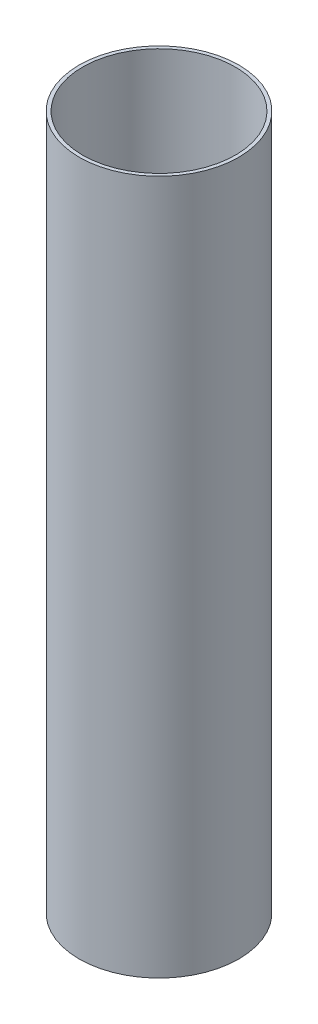
ISO-10303-21;
HEADER;
FILE_DESCRIPTION(('STEP AP214'),'2;1');
FILE_NAME('part.step','',(''),(''),'','','');
FILE_SCHEMA(('AUTOMOTIVE_DESIGN { 1 0 10303 214 1 1 1 1 }'));
ENDSEC;
DATA;
#1=APPLICATION_CONTEXT('core data for automotive mechanical design processes');
#2=APPLICATION_PROTOCOL_DEFINITION('international standard','automotive_design',2000,#1);
#3=PRODUCT_CONTEXT('',#1,'mechanical');
#4=PRODUCT('Part','Part','',(#3));
#5=PRODUCT_RELATED_PRODUCT_CATEGORY('part','',(#4));
#6=PRODUCT_DEFINITION_FORMATION('','',#4);
#7=PRODUCT_DEFINITION_CONTEXT('part definition',#1,'design');
#8=PRODUCT_DEFINITION('design','',#6,#7);
#9=PRODUCT_DEFINITION_SHAPE('','',#8);
#10=(LENGTH_UNIT() NAMED_UNIT(*) SI_UNIT(.MILLI.,.METRE.));
#11=(NAMED_UNIT(*) PLANE_ANGLE_UNIT() SI_UNIT($,.RADIAN.));
#12=(NAMED_UNIT(*) SI_UNIT($,.STERADIAN.) SOLID_ANGLE_UNIT());
#13=UNCERTAINTY_MEASURE_WITH_UNIT(LENGTH_MEASURE(1.E-05),#10,'distance_accuracy_value','');
#14=(GEOMETRIC_REPRESENTATION_CONTEXT(3) GLOBAL_UNCERTAINTY_ASSIGNED_CONTEXT((#13)) GLOBAL_UNIT_ASSIGNED_CONTEXT((#10,
#11,#12)) REPRESENTATION_CONTEXT('',''));
#15=CARTESIAN_POINT('',(0.,0.,0.));
#16=DIRECTION('',(0.,0.,1.));
#17=DIRECTION('',(1.,0.,0.));
#18=AXIS2_PLACEMENT_3D('',#15,#16,#17);
#19=CARTESIAN_POINT('',(0.,1000.,0.));
#20=DIRECTION('',(0.,1.,0.));
#21=DIRECTION('',(0.,0.,1.));
#22=AXIS2_PLACEMENT_3D('',#19,#20,#21);
#23=PLANE('',#22);
#24=CARTESIAN_POINT('',(0.,1000.,0.));
#25=DIRECTION('',(0.,1.,0.));
#26=DIRECTION('',(1.,0.,0.));
#27=AXIS2_PLACEMENT_3D('',#24,#25,#26);
#28=CIRCLE('',#27,115.);
#29=CARTESIAN_POINT('',(115.,1000.,0.));
#30=VERTEX_POINT('',#29);
#31=EDGE_CURVE('E11',#30,#30,#28,.T.);
#32=ORIENTED_EDGE('',*,*,#31,.T.);
#33=EDGE_LOOP('',(#32));
#34=FACE_BOUND('',#33,.T.);
#35=CARTESIAN_POINT('',(0.,1000.,0.));
#36=DIRECTION('',(0.,1.,0.));
#37=DIRECTION('',(0.,0.,1.));
#38=AXIS2_PLACEMENT_3D('',#35,#36,#37);
#39=CIRCLE('',#38,110.);
#40=CARTESIAN_POINT('',(0.,1000.,110.));
#41=VERTEX_POINT('',#40);
#42=EDGE_CURVE('E52',#41,#41,#39,.T.);
#43=ORIENTED_EDGE('',*,*,#42,.F.);
#44=EDGE_LOOP('',(#43));
#45=FACE_BOUND('',#44,.T.);
#46=ADVANCED_FACE('F41',(#34,#45),#23,.T.);
#47=CARTESIAN_POINT('',(0.,0.,0.));
#48=DIRECTION('',(0.,1.,0.));
#49=DIRECTION('',(0.,0.,1.));
#50=AXIS2_PLACEMENT_3D('',#47,#48,#49);
#51=PLANE('',#50);
#52=CARTESIAN_POINT('',(0.,0.,0.));
#53=DIRECTION('',(0.,1.,0.));
#54=DIRECTION('',(1.,0.,0.));
#55=AXIS2_PLACEMENT_3D('',#52,#53,#54);
#56=CIRCLE('',#55,115.);
#57=CARTESIAN_POINT('',(115.,0.,0.));
#58=VERTEX_POINT('',#57);
#59=EDGE_CURVE('E45',#58,#58,#56,.T.);
#60=ORIENTED_EDGE('',*,*,#59,.F.);
#61=EDGE_LOOP('',(#60));
#62=FACE_BOUND('',#61,.T.);
#63=CARTESIAN_POINT('',(0.,0.,0.));
#64=DIRECTION('',(0.,1.,0.));
#65=DIRECTION('',(0.,0.,1.));
#66=AXIS2_PLACEMENT_3D('',#63,#64,#65);
#67=CIRCLE('',#66,110.);
#68=CARTESIAN_POINT('',(0.,0.,110.));
#69=VERTEX_POINT('',#68);
#70=EDGE_CURVE('E54',#69,#69,#67,.T.);
#71=ORIENTED_EDGE('',*,*,#70,.T.);
#72=EDGE_LOOP('',(#71));
#73=FACE_BOUND('',#72,.T.);
#74=ADVANCED_FACE('F64',(#62,#73),#51,.F.);
#75=CARTESIAN_POINT('',(0.,1000.,0.));
#76=DIRECTION('',(0.,-1.,0.));
#77=DIRECTION('',(0.,0.,-1.));
#78=AXIS2_PLACEMENT_3D('',#75,#76,#77);
#79=CYLINDRICAL_SURFACE('',#78,115.);
#80=ORIENTED_EDGE('',*,*,#31,.F.);
#81=EDGE_LOOP('',(#80));
#82=FACE_BOUND('',#81,.T.);
#83=ORIENTED_EDGE('',*,*,#59,.T.);
#84=EDGE_LOOP('',(#83));
#85=FACE_BOUND('',#84,.T.);
#86=ADVANCED_FACE('F43',(#82,#85),#79,.T.);
#87=CARTESIAN_POINT('',(0.,1000.,0.));
#88=DIRECTION('',(0.,-1.,0.));
#89=DIRECTION('',(0.,0.,-1.));
#90=AXIS2_PLACEMENT_3D('',#87,#88,#89);
#91=CYLINDRICAL_SURFACE('',#90,110.);
#92=ORIENTED_EDGE('',*,*,#42,.T.);
#93=EDGE_LOOP('',(#92));
#94=FACE_BOUND('',#93,.T.);
#95=ORIENTED_EDGE('',*,*,#70,.F.);
#96=EDGE_LOOP('',(#95));
#97=FACE_BOUND('',#96,.T.);
#98=ADVANCED_FACE('F60',(#94,#97),#91,.F.);
#99=CLOSED_SHELL('',(#46,#74,#86,#98));
#100=MANIFOLD_SOLID_BREP('B2',#99);
#101=ADVANCED_BREP_SHAPE_REPRESENTATION('',(#18,#100),#14);
#102=SHAPE_DEFINITION_REPRESENTATION(#9,#101);
ENDSEC;
END-ISO-10303-21;
